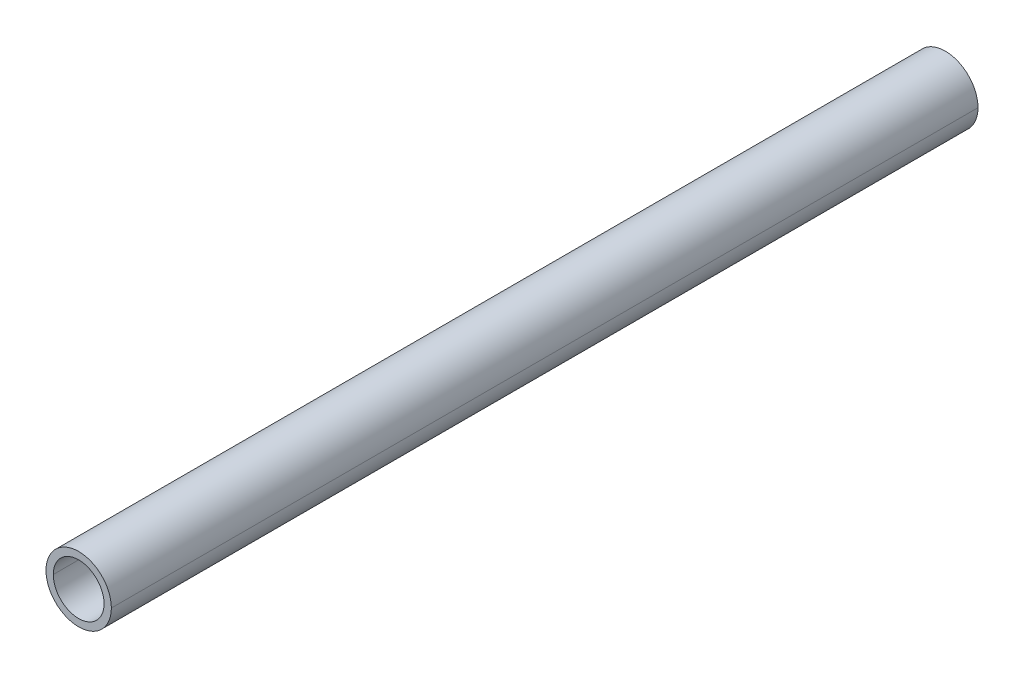
ISO-10303-21;
HEADER;
FILE_DESCRIPTION(('STEP AP214'),'2;1');
FILE_NAME('part.step','',(''),(''),'','','');
FILE_SCHEMA(('AUTOMOTIVE_DESIGN { 1 0 10303 214 1 1 1 1 }'));
ENDSEC;
DATA;
#1=APPLICATION_CONTEXT('core data for automotive mechanical design processes');
#2=APPLICATION_PROTOCOL_DEFINITION('international standard','automotive_design',2000,#1);
#3=PRODUCT_CONTEXT('',#1,'mechanical');
#4=PRODUCT('Part','Part','',(#3));
#5=PRODUCT_RELATED_PRODUCT_CATEGORY('part','',(#4));
#6=PRODUCT_DEFINITION_FORMATION('','',#4);
#7=PRODUCT_DEFINITION_CONTEXT('part definition',#1,'design');
#8=PRODUCT_DEFINITION('design','',#6,#7);
#9=PRODUCT_DEFINITION_SHAPE('','',#8);
#10=(LENGTH_UNIT() NAMED_UNIT(*) SI_UNIT(.MILLI.,.METRE.));
#11=(NAMED_UNIT(*) PLANE_ANGLE_UNIT() SI_UNIT($,.RADIAN.));
#12=(NAMED_UNIT(*) SI_UNIT($,.STERADIAN.) SOLID_ANGLE_UNIT());
#13=UNCERTAINTY_MEASURE_WITH_UNIT(LENGTH_MEASURE(1.E-05),#10,'distance_accuracy_value','');
#14=(GEOMETRIC_REPRESENTATION_CONTEXT(3) GLOBAL_UNCERTAINTY_ASSIGNED_CONTEXT((#13)) GLOBAL_UNIT_ASSIGNED_CONTEXT((#10,
#11,#12)) REPRESENTATION_CONTEXT('',''));
#15=CARTESIAN_POINT('',(0.,0.,0.));
#16=DIRECTION('',(0.,0.,1.));
#17=DIRECTION('',(1.,0.,0.));
#18=AXIS2_PLACEMENT_3D('',#15,#16,#17);
#19=CARTESIAN_POINT('',(0.,0.,238.73));
#20=DIRECTION('',(0.,0.,-1.));
#21=DIRECTION('',(-1.,0.,0.));
#22=AXIS2_PLACEMENT_3D('',#19,#20,#21);
#23=CYLINDRICAL_SURFACE('',#22,7.);
#24=DIRECTION('',(0.,0.,-1.));
#25=VECTOR('',#24,1.);
#26=CARTESIAN_POINT('',(7.,0.,238.73));
#27=LINE('',#26,#25);
#28=CARTESIAN_POINT('',(7.,0.,238.73));
#29=VERTEX_POINT('',#28);
#30=CARTESIAN_POINT('',(7.,0.,0.));
#31=VERTEX_POINT('',#30);
#32=EDGE_CURVE('E82',#29,#31,#27,.T.);
#33=ORIENTED_EDGE('',*,*,#32,.F.);
#34=CARTESIAN_POINT('',(0.,0.,238.73));
#35=DIRECTION('',(0.,0.,1.));
#36=DIRECTION('',(1.,0.,0.));
#37=AXIS2_PLACEMENT_3D('',#34,#35,#36);
#38=CIRCLE('',#37,7.);
#39=CARTESIAN_POINT('',(-7.,0.,238.73));
#40=VERTEX_POINT('',#39);
#41=EDGE_CURVE('E72',#29,#40,#38,.T.);
#42=ORIENTED_EDGE('',*,*,#41,.T.);
#43=DIRECTION('',(0.,0.,-1.));
#44=VECTOR('',#43,1.);
#45=CARTESIAN_POINT('',(-7.,0.,238.73));
#46=LINE('',#45,#44);
#47=CARTESIAN_POINT('',(-7.,0.,0.));
#48=VERTEX_POINT('',#47);
#49=EDGE_CURVE('E88',#40,#48,#46,.T.);
#50=ORIENTED_EDGE('',*,*,#49,.T.);
#51=CARTESIAN_POINT('',(0.,0.,0.));
#52=DIRECTION('',(0.,0.,1.));
#53=DIRECTION('',(1.,0.,0.));
#54=AXIS2_PLACEMENT_3D('',#51,#52,#53);
#55=CIRCLE('',#54,7.);
#56=EDGE_CURVE('E11',#31,#48,#55,.T.);
#57=ORIENTED_EDGE('',*,*,#56,.F.);
#58=EDGE_LOOP('',(#33,#42,#50,#57));
#59=FACE_BOUND('',#58,.T.);
#60=ADVANCED_FACE('F16',(#59),#23,.F.);
#61=CARTESIAN_POINT('',(0.,0.,238.73));
#62=DIRECTION('',(0.,0.,-1.));
#63=DIRECTION('',(-1.,0.,0.));
#64=AXIS2_PLACEMENT_3D('',#61,#62,#63);
#65=CYLINDRICAL_SURFACE('',#64,9.);
#66=DIRECTION('',(0.,0.,-1.));
#67=VECTOR('',#66,1.);
#68=CARTESIAN_POINT('',(9.,0.,238.73));
#69=LINE('',#68,#67);
#70=CARTESIAN_POINT('',(9.,0.,238.73));
#71=VERTEX_POINT('',#70);
#72=CARTESIAN_POINT('',(9.,0.,0.));
#73=VERTEX_POINT('',#72);
#74=EDGE_CURVE('E20',#71,#73,#69,.T.);
#75=ORIENTED_EDGE('',*,*,#74,.F.);
#76=CARTESIAN_POINT('',(0.,0.,238.73));
#77=DIRECTION('',(0.,0.,1.));
#78=DIRECTION('',(1.,0.,0.));
#79=AXIS2_PLACEMENT_3D('',#76,#77,#78);
#80=CIRCLE('',#79,9.);
#81=CARTESIAN_POINT('',(-9.,0.,238.73));
#82=VERTEX_POINT('',#81);
#83=EDGE_CURVE('E79',#82,#71,#80,.T.);
#84=ORIENTED_EDGE('',*,*,#83,.F.);
#85=DIRECTION('',(0.,0.,-1.));
#86=VECTOR('',#85,1.);
#87=CARTESIAN_POINT('',(-9.,0.,238.73));
#88=LINE('',#87,#86);
#89=CARTESIAN_POINT('',(-9.,0.,0.));
#90=VERTEX_POINT('',#89);
#91=EDGE_CURVE('E97',#82,#90,#88,.T.);
#92=ORIENTED_EDGE('',*,*,#91,.T.);
#93=CARTESIAN_POINT('',(0.,0.,0.));
#94=DIRECTION('',(0.,0.,1.));
#95=DIRECTION('',(1.,0.,0.));
#96=AXIS2_PLACEMENT_3D('',#93,#94,#95);
#97=CIRCLE('',#96,9.);
#98=EDGE_CURVE('E27',#90,#73,#97,.T.);
#99=ORIENTED_EDGE('',*,*,#98,.T.);
#100=EDGE_LOOP('',(#75,#84,#92,#99));
#101=FACE_BOUND('',#100,.T.);
#102=ADVANCED_FACE('F116',(#101),#65,.T.);
#103=CARTESIAN_POINT('',(0.,0.,0.));
#104=DIRECTION('',(0.,0.,1.));
#105=DIRECTION('',(1.,0.,0.));
#106=AXIS2_PLACEMENT_3D('',#103,#104,#105);
#107=PLANE('',#106);
#108=CARTESIAN_POINT('',(0.,0.,0.));
#109=DIRECTION('',(0.,0.,1.));
#110=DIRECTION('',(1.,0.,0.));
#111=AXIS2_PLACEMENT_3D('',#108,#109,#110);
#112=CIRCLE('',#111,7.);
#113=EDGE_CURVE('E86',#48,#31,#112,.T.);
#114=ORIENTED_EDGE('',*,*,#113,.T.);
#115=ORIENTED_EDGE('',*,*,#56,.T.);
#116=EDGE_LOOP('',(#114,#115));
#117=FACE_BOUND('',#116,.T.);
#118=ORIENTED_EDGE('',*,*,#98,.F.);
#119=CARTESIAN_POINT('',(0.,0.,0.));
#120=DIRECTION('',(0.,0.,1.));
#121=DIRECTION('',(1.,0.,0.));
#122=AXIS2_PLACEMENT_3D('',#119,#120,#121);
#123=CIRCLE('',#122,9.);
#124=EDGE_CURVE('E104',#73,#90,#123,.T.);
#125=ORIENTED_EDGE('',*,*,#124,.F.);
#126=EDGE_LOOP('',(#118,#125));
#127=FACE_BOUND('',#126,.T.);
#128=ADVANCED_FACE('F114',(#117,#127),#107,.F.);
#129=CARTESIAN_POINT('',(0.,0.,238.73));
#130=DIRECTION('',(0.,0.,1.));
#131=DIRECTION('',(1.,0.,0.));
#132=AXIS2_PLACEMENT_3D('',#129,#130,#131);
#133=PLANE('',#132);
#134=CARTESIAN_POINT('',(0.,0.,238.73));
#135=DIRECTION('',(0.,0.,1.));
#136=DIRECTION('',(1.,0.,0.));
#137=AXIS2_PLACEMENT_3D('',#134,#135,#136);
#138=CIRCLE('',#137,7.);
#139=EDGE_CURVE('E76',#40,#29,#138,.T.);
#140=ORIENTED_EDGE('',*,*,#139,.F.);
#141=ORIENTED_EDGE('',*,*,#41,.F.);
#142=EDGE_LOOP('',(#140,#141));
#143=FACE_BOUND('',#142,.T.);
#144=ORIENTED_EDGE('',*,*,#83,.T.);
#145=CARTESIAN_POINT('',(0.,0.,238.73));
#146=DIRECTION('',(0.,0.,1.));
#147=DIRECTION('',(1.,0.,0.));
#148=AXIS2_PLACEMENT_3D('',#145,#146,#147);
#149=CIRCLE('',#148,9.);
#150=EDGE_CURVE('E98',#71,#82,#149,.T.);
#151=ORIENTED_EDGE('',*,*,#150,.T.);
#152=EDGE_LOOP('',(#144,#151));
#153=FACE_BOUND('',#152,.T.);
#154=ADVANCED_FACE('F73',(#143,#153),#133,.T.);
#155=CARTESIAN_POINT('',(0.,0.,238.73));
#156=DIRECTION('',(0.,0.,-1.));
#157=DIRECTION('',(-1.,0.,0.));
#158=AXIS2_PLACEMENT_3D('',#155,#156,#157);
#159=CYLINDRICAL_SURFACE('',#158,9.);
#160=ORIENTED_EDGE('',*,*,#150,.F.);
#161=ORIENTED_EDGE('',*,*,#74,.T.);
#162=ORIENTED_EDGE('',*,*,#124,.T.);
#163=ORIENTED_EDGE('',*,*,#91,.F.);
#164=EDGE_LOOP('',(#160,#161,#162,#163));
#165=FACE_BOUND('',#164,.T.);
#166=ADVANCED_FACE('F122',(#165),#159,.T.);
#167=CARTESIAN_POINT('',(0.,0.,238.73));
#168=DIRECTION('',(0.,0.,-1.));
#169=DIRECTION('',(-1.,0.,0.));
#170=AXIS2_PLACEMENT_3D('',#167,#168,#169);
#171=CYLINDRICAL_SURFACE('',#170,7.);
#172=ORIENTED_EDGE('',*,*,#139,.T.);
#173=ORIENTED_EDGE('',*,*,#32,.T.);
#174=ORIENTED_EDGE('',*,*,#113,.F.);
#175=ORIENTED_EDGE('',*,*,#49,.F.);
#176=EDGE_LOOP('',(#172,#173,#174,#175));
#177=FACE_BOUND('',#176,.T.);
#178=ADVANCED_FACE('F18',(#177),#171,.F.);
#179=CLOSED_SHELL('',(#60,#102,#128,#154,#166,#178));
#180=MANIFOLD_SOLID_BREP('B1',#179);
#181=ADVANCED_BREP_SHAPE_REPRESENTATION('',(#18,#180),#14);
#182=SHAPE_DEFINITION_REPRESENTATION(#9,#181);
ENDSEC;
END-ISO-10303-21;
